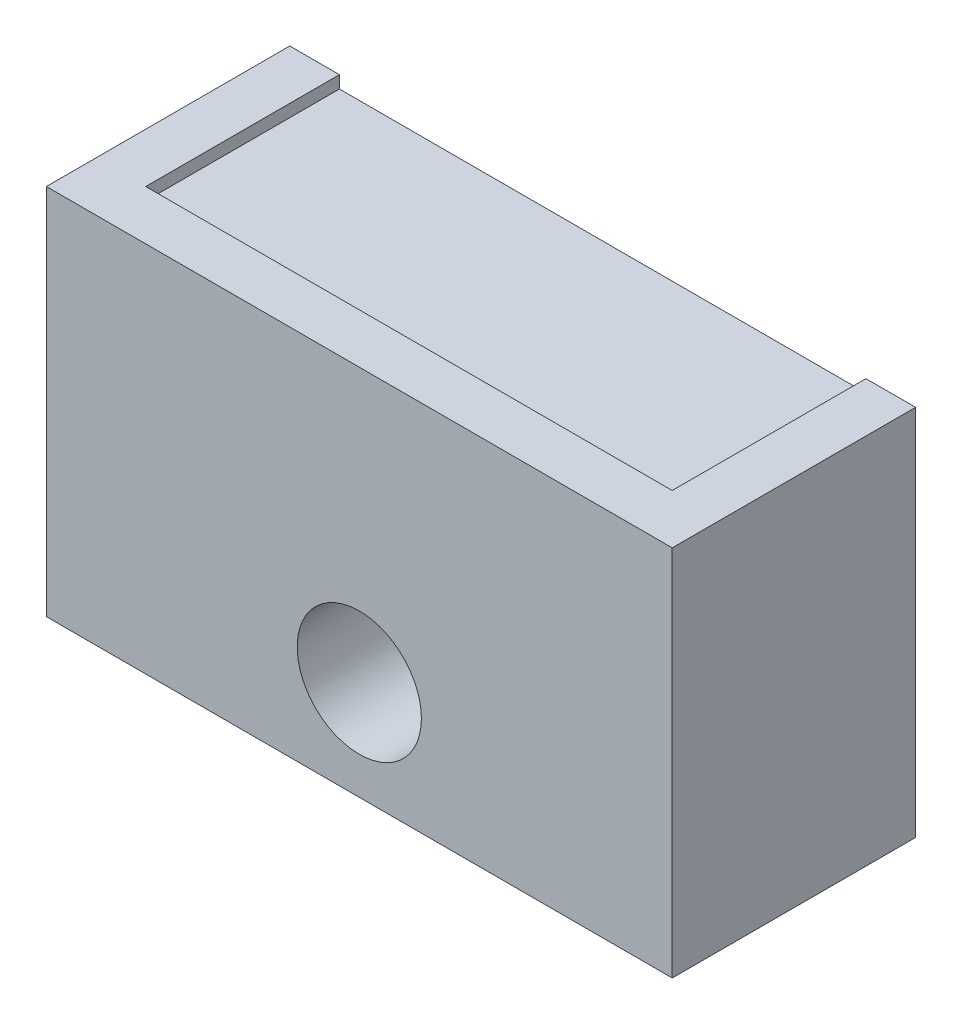
ISO-10303-21;
HEADER;
FILE_DESCRIPTION(('STEP AP214'),'2;1');
FILE_NAME('part.step','',(''),(''),'','','');
FILE_SCHEMA(('AUTOMOTIVE_DESIGN { 1 0 10303 214 1 1 1 1 }'));
ENDSEC;
DATA;
#1=APPLICATION_CONTEXT('core data for automotive mechanical design processes');
#2=APPLICATION_PROTOCOL_DEFINITION('international standard','automotive_design',2000,#1);
#3=PRODUCT_CONTEXT('',#1,'mechanical');
#4=PRODUCT('Part','Part','',(#3));
#5=PRODUCT_RELATED_PRODUCT_CATEGORY('part','',(#4));
#6=PRODUCT_DEFINITION_FORMATION('','',#4);
#7=PRODUCT_DEFINITION_CONTEXT('part definition',#1,'design');
#8=PRODUCT_DEFINITION('design','',#6,#7);
#9=PRODUCT_DEFINITION_SHAPE('','',#8);
#10=(LENGTH_UNIT() NAMED_UNIT(*) SI_UNIT(.MILLI.,.METRE.));
#11=(NAMED_UNIT(*) PLANE_ANGLE_UNIT() SI_UNIT($,.RADIAN.));
#12=(NAMED_UNIT(*) SI_UNIT($,.STERADIAN.) SOLID_ANGLE_UNIT());
#13=UNCERTAINTY_MEASURE_WITH_UNIT(LENGTH_MEASURE(1.E-05),#10,'distance_accuracy_value','');
#14=(GEOMETRIC_REPRESENTATION_CONTEXT(3) GLOBAL_UNCERTAINTY_ASSIGNED_CONTEXT((#13)) GLOBAL_UNIT_ASSIGNED_CONTEXT((#10,
#11,#12)) REPRESENTATION_CONTEXT('',''));
#15=CARTESIAN_POINT('',(0.,0.,0.));
#16=DIRECTION('',(0.,0.,1.));
#17=DIRECTION('',(1.,0.,0.));
#18=AXIS2_PLACEMENT_3D('',#15,#16,#17);
#19=CARTESIAN_POINT('',(-12.6,4.,-7.8));
#20=DIRECTION('',(0.,0.,1.));
#21=DIRECTION('',(1.,0.,0.));
#22=AXIS2_PLACEMENT_3D('',#19,#20,#21);
#23=CYLINDRICAL_SURFACE('',#22,1.);
#24=CARTESIAN_POINT('',(-12.6,4.,-7.8));
#25=DIRECTION('',(0.,0.,1.));
#26=DIRECTION('',(1.,0.,0.));
#27=AXIS2_PLACEMENT_3D('',#24,#25,#26);
#28=CIRCLE('',#27,1.);
#29=CARTESIAN_POINT('',(-11.6,4.,-7.8));
#30=VERTEX_POINT('',#29);
#31=EDGE_CURVE('E336',#30,#30,#28,.T.);
#32=ORIENTED_EDGE('',*,*,#31,.F.);
#33=EDGE_LOOP('',(#32));
#34=FACE_BOUND('',#33,.T.);
#35=CARTESIAN_POINT('',(-12.6,4.,-3.63478734259903));
#36=DIRECTION('',(0.,0.,1.));
#37=DIRECTION('',(1.,0.,0.));
#38=AXIS2_PLACEMENT_3D('',#35,#36,#37);
#39=CIRCLE('',#38,1.);
#40=CARTESIAN_POINT('',(-11.6,4.,-3.63478734259903));
#41=VERTEX_POINT('',#40);
#42=EDGE_CURVE('E41',#41,#41,#39,.F.);
#43=ORIENTED_EDGE('',*,*,#42,.F.);
#44=EDGE_LOOP('',(#43));
#45=FACE_BOUND('',#44,.T.);
#46=ADVANCED_FACE('F37',(#34,#45),#23,.F.);
#47=CARTESIAN_POINT('',(0.,0.,0.));
#48=DIRECTION('',(0.,0.,1.));
#49=DIRECTION('',(1.,0.,0.));
#50=AXIS2_PLACEMENT_3D('',#47,#48,#49);
#51=PLANE('',#50);
#52=DIRECTION('',(-1.,0.,0.));
#53=VECTOR('',#52,1.);
#54=CARTESIAN_POINT('',(0.,8.16308350215299,0.));
#55=LINE('',#54,#53);
#56=CARTESIAN_POINT('',(-2.,8.16308350215299,0.));
#57=VERTEX_POINT('',#56);
#58=CARTESIAN_POINT('',(-23.2,8.16308350215299,0.));
#59=VERTEX_POINT('',#58);
#60=EDGE_CURVE('E257',#57,#59,#55,.T.);
#61=ORIENTED_EDGE('',*,*,#60,.T.);
#62=DIRECTION('',(0.,1.,0.));
#63=VECTOR('',#62,1.);
#64=CARTESIAN_POINT('',(-23.2,0.,0.));
#65=LINE('',#64,#63);
#66=CARTESIAN_POINT('',(-23.2,13.,0.));
#67=VERTEX_POINT('',#66);
#68=EDGE_CURVE('E277',#59,#67,#65,.T.);
#69=ORIENTED_EDGE('',*,*,#68,.T.);
#70=DIRECTION('',(-1.,0.,0.));
#71=VECTOR('',#70,1.);
#72=CARTESIAN_POINT('',(0.,13.,0.));
#73=LINE('',#72,#71);
#74=CARTESIAN_POINT('',(-2.,13.,0.));
#75=VERTEX_POINT('',#74);
#76=EDGE_CURVE('E297',#75,#67,#73,.T.);
#77=ORIENTED_EDGE('',*,*,#76,.F.);
#78=DIRECTION('',(0.,-1.,0.));
#79=VECTOR('',#78,1.);
#80=CARTESIAN_POINT('',(-2.00000000000001,0.,0.));
#81=LINE('',#80,#79);
#82=EDGE_CURVE('E273',#75,#57,#81,.T.);
#83=ORIENTED_EDGE('',*,*,#82,.T.);
#84=EDGE_LOOP('',(#61,#69,#77,#83));
#85=FACE_BOUND('',#84,.T.);
#86=ADVANCED_FACE('F368',(#85),#51,.F.);
#87=CARTESIAN_POINT('',(0.,0.,2.));
#88=DIRECTION('',(-1.,0.,0.));
#89=DIRECTION('',(0.,0.,1.));
#90=AXIS2_PLACEMENT_3D('',#87,#88,#89);
#91=PLANE('',#90);
#92=DIRECTION('',(0.,0.,-1.));
#93=VECTOR('',#92,1.);
#94=CARTESIAN_POINT('',(0.,0.,2.));
#95=LINE('',#94,#93);
#96=CARTESIAN_POINT('',(0.,0.,2.));
#97=VERTEX_POINT('',#96);
#98=CARTESIAN_POINT('',(0.,0.,-7.8));
#99=VERTEX_POINT('',#98);
#100=EDGE_CURVE('E315',#97,#99,#95,.T.);
#101=ORIENTED_EDGE('',*,*,#100,.T.);
#102=DIRECTION('',(0.,-1.,0.));
#103=VECTOR('',#102,1.);
#104=CARTESIAN_POINT('',(0.,0.,-7.8));
#105=LINE('',#104,#103);
#106=CARTESIAN_POINT('',(0.,15.,-7.8));
#107=VERTEX_POINT('',#106);
#108=EDGE_CURVE('E289',#107,#99,#105,.T.);
#109=ORIENTED_EDGE('',*,*,#108,.F.);
#110=DIRECTION('',(0.,0.,-1.));
#111=VECTOR('',#110,1.);
#112=CARTESIAN_POINT('',(0.,15.,2.));
#113=LINE('',#112,#111);
#114=CARTESIAN_POINT('',(0.,15.,2.));
#115=VERTEX_POINT('',#114);
#116=EDGE_CURVE('E11',#115,#107,#113,.T.);
#117=ORIENTED_EDGE('',*,*,#116,.F.);
#118=DIRECTION('',(0.,1.,0.));
#119=VECTOR('',#118,1.);
#120=CARTESIAN_POINT('',(0.,0.,2.));
#121=LINE('',#120,#119);
#122=EDGE_CURVE('E306',#97,#115,#121,.T.);
#123=ORIENTED_EDGE('',*,*,#122,.F.);
#124=EDGE_LOOP('',(#101,#109,#117,#123));
#125=FACE_BOUND('',#124,.T.);
#126=ADVANCED_FACE('F39',(#125),#91,.F.);
#127=CARTESIAN_POINT('',(0.,15.,2.));
#128=DIRECTION('',(0.,-1.,0.));
#129=DIRECTION('',(1.,0.,0.));
#130=AXIS2_PLACEMENT_3D('',#127,#128,#129);
#131=PLANE('',#130);
#132=DIRECTION('',(1.,0.,0.));
#133=VECTOR('',#132,1.);
#134=CARTESIAN_POINT('',(0.,15.,-7.8));
#135=LINE('',#134,#133);
#136=CARTESIAN_POINT('',(-2.,15.,-7.8));
#137=VERTEX_POINT('',#136);
#138=EDGE_CURVE('E287',#137,#107,#135,.T.);
#139=ORIENTED_EDGE('',*,*,#138,.F.);
#140=DIRECTION('',(0.,0.,-1.));
#141=VECTOR('',#140,1.);
#142=CARTESIAN_POINT('',(-2.,15.,-7.8));
#143=LINE('',#142,#141);
#144=CARTESIAN_POINT('',(-2.,15.,0.));
#145=VERTEX_POINT('',#144);
#146=EDGE_CURVE('E333',#145,#137,#143,.T.);
#147=ORIENTED_EDGE('',*,*,#146,.F.);
#148=DIRECTION('',(1.,0.,0.));
#149=VECTOR('',#148,1.);
#150=CARTESIAN_POINT('',(-2.,15.,0.));
#151=LINE('',#150,#149);
#152=CARTESIAN_POINT('',(-23.2,15.,0.));
#153=VERTEX_POINT('',#152);
#154=EDGE_CURVE('E332',#153,#145,#151,.T.);
#155=ORIENTED_EDGE('',*,*,#154,.F.);
#156=DIRECTION('',(0.,0.,1.));
#157=VECTOR('',#156,1.);
#158=CARTESIAN_POINT('',(-23.2,15.,-7.8));
#159=LINE('',#158,#157);
#160=CARTESIAN_POINT('',(-23.2,15.,-7.8));
#161=VERTEX_POINT('',#160);
#162=EDGE_CURVE('E329',#161,#153,#159,.T.);
#163=ORIENTED_EDGE('',*,*,#162,.F.);
#164=CARTESIAN_POINT('',(-25.2,15.,-7.8));
#165=VERTEX_POINT('',#164);
#166=EDGE_CURVE('E196',#165,#161,#135,.T.);
#167=ORIENTED_EDGE('',*,*,#166,.F.);
#168=DIRECTION('',(0.,0.,-1.));
#169=VECTOR('',#168,1.);
#170=CARTESIAN_POINT('',(-25.2,15.,2.));
#171=LINE('',#170,#169);
#172=CARTESIAN_POINT('',(-25.2,15.,2.));
#173=VERTEX_POINT('',#172);
#174=EDGE_CURVE('E46',#173,#165,#171,.T.);
#175=ORIENTED_EDGE('',*,*,#174,.F.);
#176=DIRECTION('',(-1.,0.,0.));
#177=VECTOR('',#176,1.);
#178=CARTESIAN_POINT('',(0.,15.,2.));
#179=LINE('',#178,#177);
#180=EDGE_CURVE('E309',#115,#173,#179,.T.);
#181=ORIENTED_EDGE('',*,*,#180,.F.);
#182=ORIENTED_EDGE('',*,*,#116,.T.);
#183=EDGE_LOOP('',(#139,#147,#155,#163,#167,#175,#181,#182));
#184=FACE_BOUND('',#183,.T.);
#185=ADVANCED_FACE('F327',(#184),#131,.F.);
#186=CARTESIAN_POINT('',(-25.2,0.,2.));
#187=DIRECTION('',(1.,0.,0.));
#188=DIRECTION('',(0.,0.,-1.));
#189=AXIS2_PLACEMENT_3D('',#186,#187,#188);
#190=PLANE('',#189);
#191=ORIENTED_EDGE('',*,*,#174,.T.);
#192=DIRECTION('',(0.,1.,0.));
#193=VECTOR('',#192,1.);
#194=CARTESIAN_POINT('',(-25.2,0.,-7.8));
#195=LINE('',#194,#193);
#196=CARTESIAN_POINT('',(-25.2,0.,-7.8));
#197=VERTEX_POINT('',#196);
#198=EDGE_CURVE('E285',#197,#165,#195,.T.);
#199=ORIENTED_EDGE('',*,*,#198,.F.);
#200=DIRECTION('',(0.,0.,-1.));
#201=VECTOR('',#200,1.);
#202=CARTESIAN_POINT('',(-25.2,0.,2.));
#203=LINE('',#202,#201);
#204=CARTESIAN_POINT('',(-25.2,0.,2.));
#205=VERTEX_POINT('',#204);
#206=EDGE_CURVE('E317',#205,#197,#203,.T.);
#207=ORIENTED_EDGE('',*,*,#206,.F.);
#208=DIRECTION('',(0.,-1.,0.));
#209=VECTOR('',#208,1.);
#210=CARTESIAN_POINT('',(-25.2,0.,2.));
#211=LINE('',#210,#209);
#212=EDGE_CURVE('E311',#173,#205,#211,.T.);
#213=ORIENTED_EDGE('',*,*,#212,.F.);
#214=EDGE_LOOP('',(#191,#199,#207,#213));
#215=FACE_BOUND('',#214,.T.);
#216=ADVANCED_FACE('F323',(#215),#190,.F.);
#217=CARTESIAN_POINT('',(0.,0.,2.));
#218=DIRECTION('',(0.,1.,0.));
#219=DIRECTION('',(-1.,0.,0.));
#220=AXIS2_PLACEMENT_3D('',#217,#218,#219);
#221=PLANE('',#220);
#222=DIRECTION('',(0.,0.,1.));
#223=VECTOR('',#222,1.);
#224=CARTESIAN_POINT('',(-20.85,0.,-7.8));
#225=LINE('',#224,#223);
#226=CARTESIAN_POINT('',(-20.85,0.,-7.8));
#227=VERTEX_POINT('',#226);
#228=CARTESIAN_POINT('',(-20.85,0.,-1.3));
#229=VERTEX_POINT('',#228);
#230=EDGE_CURVE('E229',#227,#229,#225,.T.);
#231=ORIENTED_EDGE('',*,*,#230,.T.);
#232=DIRECTION('',(-1.,0.,0.));
#233=VECTOR('',#232,1.);
#234=CARTESIAN_POINT('',(-15.8478878615172,0.,-1.3));
#235=LINE('',#234,#233);
#236=CARTESIAN_POINT('',(-15.8478878615172,0.,-1.3));
#237=VERTEX_POINT('',#236);
#238=EDGE_CURVE('E61',#237,#229,#235,.T.);
#239=ORIENTED_EDGE('',*,*,#238,.F.);
#240=DIRECTION('',(0.,0.,1.));
#241=VECTOR('',#240,1.);
#242=CARTESIAN_POINT('',(-15.8478878615172,0.,-7.8));
#243=LINE('',#242,#241);
#244=CARTESIAN_POINT('',(-15.8478878615172,0.,-7.8));
#245=VERTEX_POINT('',#244);
#246=EDGE_CURVE('E245',#245,#237,#243,.T.);
#247=ORIENTED_EDGE('',*,*,#246,.F.);
#248=DIRECTION('',(-1.,0.,0.));
#249=VECTOR('',#248,1.);
#250=CARTESIAN_POINT('',(0.,0.,-7.8));
#251=LINE('',#250,#249);
#252=CARTESIAN_POINT('',(-9.35,0.,-7.8));
#253=VERTEX_POINT('',#252);
#254=EDGE_CURVE('E243',#253,#245,#251,.T.);
#255=ORIENTED_EDGE('',*,*,#254,.F.);
#256=DIRECTION('',(0.,0.,1.));
#257=VECTOR('',#256,1.);
#258=CARTESIAN_POINT('',(-9.35,0.,-7.8));
#259=LINE('',#258,#257);
#260=CARTESIAN_POINT('',(-9.35,0.,-1.3));
#261=VERTEX_POINT('',#260);
#262=EDGE_CURVE('E248',#253,#261,#259,.T.);
#263=ORIENTED_EDGE('',*,*,#262,.T.);
#264=DIRECTION('',(-1.,0.,0.));
#265=VECTOR('',#264,1.);
#266=CARTESIAN_POINT('',(-4.35,0.,-1.3));
#267=LINE('',#266,#265);
#268=CARTESIAN_POINT('',(-4.35,0.,-1.3));
#269=VERTEX_POINT('',#268);
#270=EDGE_CURVE('E214',#269,#261,#267,.T.);
#271=ORIENTED_EDGE('',*,*,#270,.F.);
#272=DIRECTION('',(0.,0.,1.));
#273=VECTOR('',#272,1.);
#274=CARTESIAN_POINT('',(-4.35,0.,-7.8));
#275=LINE('',#274,#273);
#276=CARTESIAN_POINT('',(-4.35,0.,-7.8));
#277=VERTEX_POINT('',#276);
#278=EDGE_CURVE('E264',#277,#269,#275,.T.);
#279=ORIENTED_EDGE('',*,*,#278,.F.);
#280=DIRECTION('',(-1.,0.,0.));
#281=VECTOR('',#280,1.);
#282=CARTESIAN_POINT('',(0.,0.,-7.8));
#283=LINE('',#282,#281);
#284=EDGE_CURVE('E292',#99,#277,#283,.T.);
#285=ORIENTED_EDGE('',*,*,#284,.F.);
#286=ORIENTED_EDGE('',*,*,#100,.F.);
#287=DIRECTION('',(1.,0.,0.));
#288=VECTOR('',#287,1.);
#289=CARTESIAN_POINT('',(0.,0.,2.));
#290=LINE('',#289,#288);
#291=EDGE_CURVE('E313',#205,#97,#290,.T.);
#292=ORIENTED_EDGE('',*,*,#291,.F.);
#293=ORIENTED_EDGE('',*,*,#206,.T.);
#294=DIRECTION('',(-1.,0.,0.));
#295=VECTOR('',#294,1.);
#296=CARTESIAN_POINT('',(0.,0.,-7.8));
#297=LINE('',#296,#295);
#298=EDGE_CURVE('E282',#227,#197,#297,.T.);
#299=ORIENTED_EDGE('',*,*,#298,.F.);
#300=EDGE_LOOP('',(#231,#239,#247,#255,#263,#271,#279,#285,#286,#292,#293,#299));
#301=FACE_BOUND('',#300,.T.);
#302=ADVANCED_FACE('F351',(#301),#221,.F.);
#303=CARTESIAN_POINT('',(0.,0.,2.));
#304=DIRECTION('',(0.,0.,1.));
#305=DIRECTION('',(1.,0.,0.));
#306=AXIS2_PLACEMENT_3D('',#303,#304,#305);
#307=PLANE('',#306);
#308=CARTESIAN_POINT('',(-12.6,4.,2.));
#309=DIRECTION('',(0.,0.,1.));
#310=DIRECTION('',(1.,0.,0.));
#311=AXIS2_PLACEMENT_3D('',#308,#309,#310);
#312=CIRCLE('',#311,2.5);
#313=CARTESIAN_POINT('',(-10.1,4.,2.));
#314=VERTEX_POINT('',#313);
#315=EDGE_CURVE('E715',#314,#314,#312,.T.);
#316=ORIENTED_EDGE('',*,*,#315,.F.);
#317=EDGE_LOOP('',(#316));
#318=FACE_BOUND('',#317,.T.);
#319=ORIENTED_EDGE('',*,*,#122,.T.);
#320=ORIENTED_EDGE('',*,*,#180,.T.);
#321=ORIENTED_EDGE('',*,*,#212,.T.);
#322=ORIENTED_EDGE('',*,*,#291,.T.);
#323=EDGE_LOOP('',(#319,#320,#321,#322));
#324=FACE_BOUND('',#323,.T.);
#325=ADVANCED_FACE('F385',(#318,#324),#307,.T.);
#326=CARTESIAN_POINT('',(-2.00000000000001,0.,-7.8));
#327=DIRECTION('',(-1.,0.,0.));
#328=DIRECTION('',(0.,-1.,0.));
#329=AXIS2_PLACEMENT_3D('',#326,#327,#328);
#330=PLANE('',#329);
#331=DIRECTION('',(0.,0.,1.));
#332=VECTOR('',#331,1.);
#333=CARTESIAN_POINT('',(-2.,8.16308350215299,-7.8));
#334=LINE('',#333,#332);
#335=CARTESIAN_POINT('',(-2.,8.16308350215299,-7.8));
#336=VERTEX_POINT('',#335);
#337=EDGE_CURVE('E268',#336,#57,#334,.T.);
#338=ORIENTED_EDGE('',*,*,#337,.T.);
#339=ORIENTED_EDGE('',*,*,#82,.F.);
#340=DIRECTION('',(0.,0.,1.));
#341=VECTOR('',#340,1.);
#342=CARTESIAN_POINT('',(-2.,13.,-7.8));
#343=LINE('',#342,#341);
#344=CARTESIAN_POINT('',(-2.,13.,-7.8));
#345=VERTEX_POINT('',#344);
#346=EDGE_CURVE('E303',#345,#75,#343,.T.);
#347=ORIENTED_EDGE('',*,*,#346,.F.);
#348=DIRECTION('',(0.,-1.,0.));
#349=VECTOR('',#348,1.);
#350=CARTESIAN_POINT('',(-2.00000000000001,0.,-7.8));
#351=LINE('',#350,#349);
#352=EDGE_CURVE('E274',#345,#336,#351,.T.);
#353=ORIENTED_EDGE('',*,*,#352,.T.);
#354=EDGE_LOOP('',(#338,#339,#347,#353));
#355=FACE_BOUND('',#354,.T.);
#356=ADVANCED_FACE('F366',(#355),#330,.T.);
#357=CARTESIAN_POINT('',(0.,13.,-7.8));
#358=DIRECTION('',(0.,1.,0.));
#359=DIRECTION('',(0.,0.,1.));
#360=AXIS2_PLACEMENT_3D('',#357,#358,#359);
#361=PLANE('',#360);
#362=ORIENTED_EDGE('',*,*,#76,.T.);
#363=DIRECTION('',(0.,0.,1.));
#364=VECTOR('',#363,1.);
#365=CARTESIAN_POINT('',(-23.2,13.,-7.8));
#366=LINE('',#365,#364);
#367=CARTESIAN_POINT('',(-23.2,13.,-7.8));
#368=VERTEX_POINT('',#367);
#369=EDGE_CURVE('E294',#368,#67,#366,.T.);
#370=ORIENTED_EDGE('',*,*,#369,.F.);
#371=DIRECTION('',(-1.,0.,0.));
#372=VECTOR('',#371,1.);
#373=CARTESIAN_POINT('',(0.,13.,-7.8));
#374=LINE('',#373,#372);
#375=EDGE_CURVE('E276',#345,#368,#374,.T.);
#376=ORIENTED_EDGE('',*,*,#375,.F.);
#377=ORIENTED_EDGE('',*,*,#346,.T.);
#378=EDGE_LOOP('',(#362,#370,#376,#377));
#379=FACE_BOUND('',#378,.T.);
#380=ADVANCED_FACE('F373',(#379),#361,.F.);
#381=CARTESIAN_POINT('',(-23.2,0.,-7.8));
#382=DIRECTION('',(1.,0.,0.));
#383=DIRECTION('',(0.,0.,-1.));
#384=AXIS2_PLACEMENT_3D('',#381,#382,#383);
#385=PLANE('',#384);
#386=DIRECTION('',(0.,0.,1.));
#387=VECTOR('',#386,1.);
#388=CARTESIAN_POINT('',(-23.2,8.16308350215299,-7.8));
#389=LINE('',#388,#387);
#390=CARTESIAN_POINT('',(-23.2,8.16308350215299,-7.8));
#391=VERTEX_POINT('',#390);
#392=EDGE_CURVE('E226',#391,#59,#389,.T.);
#393=ORIENTED_EDGE('',*,*,#392,.F.);
#394=DIRECTION('',(0.,1.,0.));
#395=VECTOR('',#394,1.);
#396=CARTESIAN_POINT('',(-23.2,0.,-7.8));
#397=LINE('',#396,#395);
#398=EDGE_CURVE('E280',#391,#368,#397,.T.);
#399=ORIENTED_EDGE('',*,*,#398,.T.);
#400=ORIENTED_EDGE('',*,*,#369,.T.);
#401=ORIENTED_EDGE('',*,*,#68,.F.);
#402=EDGE_LOOP('',(#393,#399,#400,#401));
#403=FACE_BOUND('',#402,.T.);
#404=ADVANCED_FACE('F377',(#403),#385,.T.);
#405=CARTESIAN_POINT('',(0.,0.,-7.8));
#406=DIRECTION('',(0.,0.,-1.));
#407=DIRECTION('',(-1.,0.,0.));
#408=AXIS2_PLACEMENT_3D('',#405,#406,#407);
#409=PLANE('',#408);
#410=DIRECTION('',(0.,1.,0.));
#411=VECTOR('',#410,1.);
#412=CARTESIAN_POINT('',(-2.,14.5,-7.8));
#413=LINE('',#412,#411);
#414=CARTESIAN_POINT('',(-2.,14.5,-7.8));
#415=VERTEX_POINT('',#414);
#416=EDGE_CURVE('E197',#415,#137,#413,.T.);
#417=ORIENTED_EDGE('',*,*,#416,.T.);
#418=ORIENTED_EDGE('',*,*,#138,.T.);
#419=ORIENTED_EDGE('',*,*,#108,.T.);
#420=ORIENTED_EDGE('',*,*,#284,.T.);
#421=DIRECTION('',(0.,-1.,0.));
#422=VECTOR('',#421,1.);
#423=CARTESIAN_POINT('',(-4.35,0.,-7.8));
#424=LINE('',#423,#422);
#425=CARTESIAN_POINT('',(-4.35,8.16308350215299,-7.8));
#426=VERTEX_POINT('',#425);
#427=EDGE_CURVE('E258',#426,#277,#424,.T.);
#428=ORIENTED_EDGE('',*,*,#427,.F.);
#429=DIRECTION('',(-1.,0.,0.));
#430=VECTOR('',#429,1.);
#431=CARTESIAN_POINT('',(0.,8.16308350215299,-7.8));
#432=LINE('',#431,#430);
#433=EDGE_CURVE('E261',#336,#426,#432,.T.);
#434=ORIENTED_EDGE('',*,*,#433,.F.);
#435=ORIENTED_EDGE('',*,*,#352,.F.);
#436=ORIENTED_EDGE('',*,*,#375,.T.);
#437=ORIENTED_EDGE('',*,*,#398,.F.);
#438=DIRECTION('',(-1.,0.,0.));
#439=VECTOR('',#438,1.);
#440=CARTESIAN_POINT('',(0.,8.16308350215299,-7.8));
#441=LINE('',#440,#439);
#442=CARTESIAN_POINT('',(-20.85,8.16308350215299,-7.8));
#443=VERTEX_POINT('',#442);
#444=EDGE_CURVE('E220',#443,#391,#441,.T.);
#445=ORIENTED_EDGE('',*,*,#444,.F.);
#446=DIRECTION('',(0.,-1.,0.));
#447=VECTOR('',#446,1.);
#448=CARTESIAN_POINT('',(-20.85,0.,-7.8));
#449=LINE('',#448,#447);
#450=EDGE_CURVE('E223',#443,#227,#449,.T.);
#451=ORIENTED_EDGE('',*,*,#450,.T.);
#452=ORIENTED_EDGE('',*,*,#298,.T.);
#453=ORIENTED_EDGE('',*,*,#198,.T.);
#454=ORIENTED_EDGE('',*,*,#166,.T.);
#455=DIRECTION('',(0.,1.,0.));
#456=VECTOR('',#455,1.);
#457=CARTESIAN_POINT('',(-23.2,14.5,-7.8));
#458=LINE('',#457,#456);
#459=CARTESIAN_POINT('',(-23.2,14.5,-7.8));
#460=VERTEX_POINT('',#459);
#461=EDGE_CURVE('E180',#460,#161,#458,.T.);
#462=ORIENTED_EDGE('',*,*,#461,.F.);
#463=DIRECTION('',(-1.,0.,0.));
#464=VECTOR('',#463,1.);
#465=CARTESIAN_POINT('',(-2.,14.5,-7.8));
#466=LINE('',#465,#464);
#467=EDGE_CURVE('E185',#415,#460,#466,.T.);
#468=ORIENTED_EDGE('',*,*,#467,.F.);
#469=EDGE_LOOP('',(#417,#418,#419,#420,#428,#434,#435,#436,#437,#445,#451,#452,#453,#454,#462,#468));
#470=FACE_BOUND('',#469,.T.);
#471=ADVANCED_FACE('F193',(#470),#409,.T.);
#472=CARTESIAN_POINT('',(-4.35,0.,-7.8));
#473=DIRECTION('',(-1.,0.,0.));
#474=DIRECTION('',(0.,0.,1.));
#475=AXIS2_PLACEMENT_3D('',#472,#473,#474);
#476=PLANE('',#475);
#477=DIRECTION('',(0.,-1.,0.));
#478=VECTOR('',#477,1.);
#479=CARTESIAN_POINT('',(-4.35,8.16308350215299,-1.3));
#480=LINE('',#479,#478);
#481=CARTESIAN_POINT('',(-4.35,8.16308350215299,-1.3));
#482=VERTEX_POINT('',#481);
#483=EDGE_CURVE('E211',#482,#269,#480,.T.);
#484=ORIENTED_EDGE('',*,*,#483,.F.);
#485=DIRECTION('',(0.,0.,1.));
#486=VECTOR('',#485,1.);
#487=CARTESIAN_POINT('',(-4.35,8.16308350215299,-7.8));
#488=LINE('',#487,#486);
#489=EDGE_CURVE('E270',#426,#482,#488,.T.);
#490=ORIENTED_EDGE('',*,*,#489,.F.);
#491=ORIENTED_EDGE('',*,*,#427,.T.);
#492=ORIENTED_EDGE('',*,*,#278,.T.);
#493=EDGE_LOOP('',(#484,#490,#491,#492));
#494=FACE_BOUND('',#493,.T.);
#495=ADVANCED_FACE('F356',(#494),#476,.T.);
#496=CARTESIAN_POINT('',(0.,8.16308350215299,-7.8));
#497=DIRECTION('',(0.,1.,0.));
#498=DIRECTION('',(0.,0.,1.));
#499=AXIS2_PLACEMENT_3D('',#496,#497,#498);
#500=PLANE('',#499);
#501=ORIENTED_EDGE('',*,*,#60,.F.);
#502=ORIENTED_EDGE('',*,*,#337,.F.);
#503=ORIENTED_EDGE('',*,*,#433,.T.);
#504=ORIENTED_EDGE('',*,*,#489,.T.);
#505=DIRECTION('',(1.,0.,0.));
#506=VECTOR('',#505,1.);
#507=CARTESIAN_POINT('',(-4.35,8.16308350215299,-1.3));
#508=LINE('',#507,#506);
#509=CARTESIAN_POINT('',(-9.35,8.16308350215299,-1.3));
#510=VERTEX_POINT('',#509);
#511=EDGE_CURVE('E218',#510,#482,#508,.T.);
#512=ORIENTED_EDGE('',*,*,#511,.F.);
#513=DIRECTION('',(0.,0.,1.));
#514=VECTOR('',#513,1.);
#515=CARTESIAN_POINT('',(-9.35,8.16308350215299,-7.8));
#516=LINE('',#515,#514);
#517=CARTESIAN_POINT('',(-9.35,8.16308350215299,-7.8));
#518=VERTEX_POINT('',#517);
#519=EDGE_CURVE('E251',#518,#510,#516,.T.);
#520=ORIENTED_EDGE('',*,*,#519,.F.);
#521=DIRECTION('',(-1.,0.,0.));
#522=VECTOR('',#521,1.);
#523=CARTESIAN_POINT('',(0.,8.16308350215299,-7.8));
#524=LINE('',#523,#522);
#525=CARTESIAN_POINT('',(-15.8478878615172,8.16308350215299,-7.8));
#526=VERTEX_POINT('',#525);
#527=EDGE_CURVE('E238',#518,#526,#524,.T.);
#528=ORIENTED_EDGE('',*,*,#527,.T.);
#529=DIRECTION('',(0.,0.,1.));
#530=VECTOR('',#529,1.);
#531=CARTESIAN_POINT('',(-15.8478878615172,8.16308350215299,-7.8));
#532=LINE('',#531,#530);
#533=CARTESIAN_POINT('',(-15.8478878615172,8.16308350215299,-1.3));
#534=VERTEX_POINT('',#533);
#535=EDGE_CURVE('E254',#526,#534,#532,.T.);
#536=ORIENTED_EDGE('',*,*,#535,.T.);
#537=DIRECTION('',(1.,0.,0.));
#538=VECTOR('',#537,1.);
#539=CARTESIAN_POINT('',(-15.8478878615172,8.16308350215299,-1.3));
#540=LINE('',#539,#538);
#541=CARTESIAN_POINT('',(-20.85,8.16308350215299,-1.3));
#542=VERTEX_POINT('',#541);
#543=EDGE_CURVE('E209',#542,#534,#540,.T.);
#544=ORIENTED_EDGE('',*,*,#543,.F.);
#545=DIRECTION('',(0.,0.,1.));
#546=VECTOR('',#545,1.);
#547=CARTESIAN_POINT('',(-20.85,8.16308350215299,-7.8));
#548=LINE('',#547,#546);
#549=EDGE_CURVE('E232',#443,#542,#548,.T.);
#550=ORIENTED_EDGE('',*,*,#549,.F.);
#551=ORIENTED_EDGE('',*,*,#444,.T.);
#552=ORIENTED_EDGE('',*,*,#392,.T.);
#553=EDGE_LOOP('',(#501,#502,#503,#504,#512,#520,#528,#536,#544,#550,#551,#552));
#554=FACE_BOUND('',#553,.T.);
#555=ADVANCED_FACE('F362',(#554),#500,.T.);
#556=CARTESIAN_POINT('',(-15.8478878615172,0.,-7.8));
#557=DIRECTION('',(-1.,0.,0.));
#558=DIRECTION('',(0.,0.,1.));
#559=AXIS2_PLACEMENT_3D('',#556,#557,#558);
#560=PLANE('',#559);
#561=DIRECTION('',(0.,-1.,0.));
#562=VECTOR('',#561,1.);
#563=CARTESIAN_POINT('',(-15.8478878615172,8.16308350215299,-1.3));
#564=LINE('',#563,#562);
#565=EDGE_CURVE('E204',#534,#237,#564,.T.);
#566=ORIENTED_EDGE('',*,*,#565,.F.);
#567=ORIENTED_EDGE('',*,*,#535,.F.);
#568=DIRECTION('',(0.,-1.,0.));
#569=VECTOR('',#568,1.);
#570=CARTESIAN_POINT('',(-15.8478878615172,0.,-7.8));
#571=LINE('',#570,#569);
#572=EDGE_CURVE('E235',#526,#245,#571,.T.);
#573=ORIENTED_EDGE('',*,*,#572,.T.);
#574=ORIENTED_EDGE('',*,*,#246,.T.);
#575=EDGE_LOOP('',(#566,#567,#573,#574));
#576=FACE_BOUND('',#575,.T.);
#577=ADVANCED_FACE('F429',(#576),#560,.T.);
#578=CARTESIAN_POINT('',(-9.35,0.,-7.8));
#579=DIRECTION('',(-1.,0.,0.));
#580=DIRECTION('',(0.,0.,1.));
#581=AXIS2_PLACEMENT_3D('',#578,#579,#580);
#582=PLANE('',#581);
#583=ORIENTED_EDGE('',*,*,#519,.T.);
#584=DIRECTION('',(0.,1.,0.));
#585=VECTOR('',#584,1.);
#586=CARTESIAN_POINT('',(-9.35,8.16308350215299,-1.3));
#587=LINE('',#586,#585);
#588=EDGE_CURVE('E216',#261,#510,#587,.T.);
#589=ORIENTED_EDGE('',*,*,#588,.F.);
#590=ORIENTED_EDGE('',*,*,#262,.F.);
#591=DIRECTION('',(0.,-1.,0.));
#592=VECTOR('',#591,1.);
#593=CARTESIAN_POINT('',(-9.35,0.,-7.8));
#594=LINE('',#593,#592);
#595=EDGE_CURVE('E241',#518,#253,#594,.T.);
#596=ORIENTED_EDGE('',*,*,#595,.F.);
#597=EDGE_LOOP('',(#583,#589,#590,#596));
#598=FACE_BOUND('',#597,.T.);
#599=ADVANCED_FACE('F425',(#598),#582,.F.);
#600=CARTESIAN_POINT('',(0.,0.,-7.8));
#601=DIRECTION('',(0.,0.,-1.));
#602=DIRECTION('',(-1.,0.,0.));
#603=AXIS2_PLACEMENT_3D('',#600,#601,#602);
#604=PLANE('',#603);
#605=ORIENTED_EDGE('',*,*,#31,.T.);
#606=EDGE_LOOP('',(#605));
#607=FACE_BOUND('',#606,.T.);
#608=ORIENTED_EDGE('',*,*,#572,.F.);
#609=ORIENTED_EDGE('',*,*,#527,.F.);
#610=ORIENTED_EDGE('',*,*,#595,.T.);
#611=ORIENTED_EDGE('',*,*,#254,.T.);
#612=EDGE_LOOP('',(#608,#609,#610,#611));
#613=FACE_BOUND('',#612,.T.);
#614=ADVANCED_FACE('F422',(#607,#613),#604,.T.);
#615=CARTESIAN_POINT('',(-20.85,0.,-7.8));
#616=DIRECTION('',(-1.,0.,0.));
#617=DIRECTION('',(0.,0.,1.));
#618=AXIS2_PLACEMENT_3D('',#615,#616,#617);
#619=PLANE('',#618);
#620=ORIENTED_EDGE('',*,*,#549,.T.);
#621=DIRECTION('',(0.,1.,0.));
#622=VECTOR('',#621,1.);
#623=CARTESIAN_POINT('',(-20.85,8.16308350215299,-1.3));
#624=LINE('',#623,#622);
#625=EDGE_CURVE('E207',#229,#542,#624,.T.);
#626=ORIENTED_EDGE('',*,*,#625,.F.);
#627=ORIENTED_EDGE('',*,*,#230,.F.);
#628=ORIENTED_EDGE('',*,*,#450,.F.);
#629=EDGE_LOOP('',(#620,#626,#627,#628));
#630=FACE_BOUND('',#629,.T.);
#631=ADVANCED_FACE('F382',(#630),#619,.F.);
#632=CARTESIAN_POINT('',(0.,0.,-1.3));
#633=DIRECTION('',(0.,0.,-1.));
#634=DIRECTION('',(-1.,0.,0.));
#635=AXIS2_PLACEMENT_3D('',#632,#633,#634);
#636=PLANE('',#635);
#637=ORIENTED_EDGE('',*,*,#483,.T.);
#638=ORIENTED_EDGE('',*,*,#270,.T.);
#639=ORIENTED_EDGE('',*,*,#588,.T.);
#640=ORIENTED_EDGE('',*,*,#511,.T.);
#641=EDGE_LOOP('',(#637,#638,#639,#640));
#642=FACE_BOUND('',#641,.T.);
#643=ADVANCED_FACE('F416',(#642),#636,.T.);
#644=CARTESIAN_POINT('',(0.,0.,-1.3));
#645=DIRECTION('',(0.,0.,-1.));
#646=DIRECTION('',(-1.,0.,0.));
#647=AXIS2_PLACEMENT_3D('',#644,#645,#646);
#648=PLANE('',#647);
#649=ORIENTED_EDGE('',*,*,#565,.T.);
#650=ORIENTED_EDGE('',*,*,#238,.T.);
#651=ORIENTED_EDGE('',*,*,#625,.T.);
#652=ORIENTED_EDGE('',*,*,#543,.T.);
#653=EDGE_LOOP('',(#649,#650,#651,#652));
#654=FACE_BOUND('',#653,.T.);
#655=ADVANCED_FACE('F413',(#654),#648,.T.);
#656=CARTESIAN_POINT('',(-2.,14.5,-7.8));
#657=DIRECTION('',(1.,0.,0.));
#658=DIRECTION('',(0.,1.,0.));
#659=AXIS2_PLACEMENT_3D('',#656,#657,#658);
#660=PLANE('',#659);
#661=ORIENTED_EDGE('',*,*,#146,.T.);
#662=ORIENTED_EDGE('',*,*,#416,.F.);
#663=DIRECTION('',(0.,0.,-1.));
#664=VECTOR('',#663,1.);
#665=CARTESIAN_POINT('',(-2.,14.5,-7.8));
#666=LINE('',#665,#664);
#667=CARTESIAN_POINT('',(-2.,14.5,0.));
#668=VERTEX_POINT('',#667);
#669=EDGE_CURVE('E53',#668,#415,#666,.T.);
#670=ORIENTED_EDGE('',*,*,#669,.F.);
#671=DIRECTION('',(0.,1.,0.));
#672=VECTOR('',#671,1.);
#673=CARTESIAN_POINT('',(-2.,14.5,0.));
#674=LINE('',#673,#672);
#675=EDGE_CURVE('E199',#668,#145,#674,.T.);
#676=ORIENTED_EDGE('',*,*,#675,.T.);
#677=EDGE_LOOP('',(#661,#662,#670,#676));
#678=FACE_BOUND('',#677,.T.);
#679=ADVANCED_FACE('F340',(#678),#660,.F.);
#680=CARTESIAN_POINT('',(-2.,14.5,0.));
#681=DIRECTION('',(0.,0.,1.));
#682=DIRECTION('',(1.,0.,0.));
#683=AXIS2_PLACEMENT_3D('',#680,#681,#682);
#684=PLANE('',#683);
#685=ORIENTED_EDGE('',*,*,#154,.T.);
#686=ORIENTED_EDGE('',*,*,#675,.F.);
#687=DIRECTION('',(1.,0.,0.));
#688=VECTOR('',#687,1.);
#689=CARTESIAN_POINT('',(-2.,14.5,0.));
#690=LINE('',#689,#688);
#691=CARTESIAN_POINT('',(-23.2,14.5,0.));
#692=VERTEX_POINT('',#691);
#693=EDGE_CURVE('E184',#692,#668,#690,.T.);
#694=ORIENTED_EDGE('',*,*,#693,.F.);
#695=DIRECTION('',(0.,1.,0.));
#696=VECTOR('',#695,1.);
#697=CARTESIAN_POINT('',(-23.2,14.5,0.));
#698=LINE('',#697,#696);
#699=EDGE_CURVE('E182',#692,#153,#698,.T.);
#700=ORIENTED_EDGE('',*,*,#699,.T.);
#701=EDGE_LOOP('',(#685,#686,#694,#700));
#702=FACE_BOUND('',#701,.T.);
#703=ADVANCED_FACE('F342',(#702),#684,.F.);
#704=CARTESIAN_POINT('',(-23.2,14.5,-7.8));
#705=DIRECTION('',(-1.,0.,0.));
#706=DIRECTION('',(0.,-1.,0.));
#707=AXIS2_PLACEMENT_3D('',#704,#705,#706);
#708=PLANE('',#707);
#709=ORIENTED_EDGE('',*,*,#162,.T.);
#710=ORIENTED_EDGE('',*,*,#699,.F.);
#711=DIRECTION('',(0.,0.,1.));
#712=VECTOR('',#711,1.);
#713=CARTESIAN_POINT('',(-23.2,14.5,-7.8));
#714=LINE('',#713,#712);
#715=EDGE_CURVE('E176',#460,#692,#714,.T.);
#716=ORIENTED_EDGE('',*,*,#715,.F.);
#717=ORIENTED_EDGE('',*,*,#461,.T.);
#718=EDGE_LOOP('',(#709,#710,#716,#717));
#719=FACE_BOUND('',#718,.T.);
#720=ADVANCED_FACE('F178',(#719),#708,.F.);
#721=CARTESIAN_POINT('',(0.,14.5,0.));
#722=DIRECTION('',(0.,-1.,0.));
#723=DIRECTION('',(1.,0.,0.));
#724=AXIS2_PLACEMENT_3D('',#721,#722,#723);
#725=PLANE('',#724);
#726=ORIENTED_EDGE('',*,*,#669,.T.);
#727=ORIENTED_EDGE('',*,*,#467,.T.);
#728=ORIENTED_EDGE('',*,*,#715,.T.);
#729=ORIENTED_EDGE('',*,*,#693,.T.);
#730=EDGE_LOOP('',(#726,#727,#728,#729));
#731=FACE_BOUND('',#730,.T.);
#732=ADVANCED_FACE('F188',(#731),#725,.F.);
#733=CARTESIAN_POINT('',(-12.6,4.,-3.63478734259903));
#734=DIRECTION('',(0.,0.,1.));
#735=DIRECTION('',(1.,0.,0.));
#736=AXIS2_PLACEMENT_3D('',#733,#734,#735);
#737=PLANE('',#736);
#738=CARTESIAN_POINT('',(-12.6,4.,-3.63478734259903));
#739=DIRECTION('',(0.,0.,1.));
#740=DIRECTION('',(1.,0.,0.));
#741=AXIS2_PLACEMENT_3D('',#738,#739,#740);
#742=CIRCLE('',#741,2.5);
#743=CARTESIAN_POINT('',(-10.1,4.,-3.63478734259903));
#744=VERTEX_POINT('',#743);
#745=EDGE_CURVE('E712',#744,#744,#742,.T.);
#746=ORIENTED_EDGE('',*,*,#745,.T.);
#747=EDGE_LOOP('',(#746));
#748=FACE_BOUND('',#747,.T.);
#749=ORIENTED_EDGE('',*,*,#42,.T.);
#750=EDGE_LOOP('',(#749));
#751=FACE_BOUND('',#750,.T.);
#752=ADVANCED_FACE('F406',(#748,#751),#737,.T.);
#753=CARTESIAN_POINT('',(-12.6,4.,-3.63478734259903));
#754=DIRECTION('',(0.,0.,1.));
#755=DIRECTION('',(1.,0.,0.));
#756=AXIS2_PLACEMENT_3D('',#753,#754,#755);
#757=CYLINDRICAL_SURFACE('',#756,2.5);
#758=ORIENTED_EDGE('',*,*,#745,.F.);
#759=EDGE_LOOP('',(#758));
#760=FACE_BOUND('',#759,.T.);
#761=ORIENTED_EDGE('',*,*,#315,.T.);
#762=EDGE_LOOP('',(#761));
#763=FACE_BOUND('',#762,.T.);
#764=ADVANCED_FACE('F402',(#760,#763),#757,.F.);
#765=CLOSED_SHELL('',(#46,#86,#126,#185,#216,#302,#325,#356,#380,#404,#471,#495,#555,#577,#599,
#614,#631,#643,#655,#679,#703,#720,#732,#752,#764));
#766=MANIFOLD_SOLID_BREP('B2',#765);
#767=ADVANCED_BREP_SHAPE_REPRESENTATION('',(#18,#766),#14);
#768=SHAPE_DEFINITION_REPRESENTATION(#9,#767);
ENDSEC;
END-ISO-10303-21;
